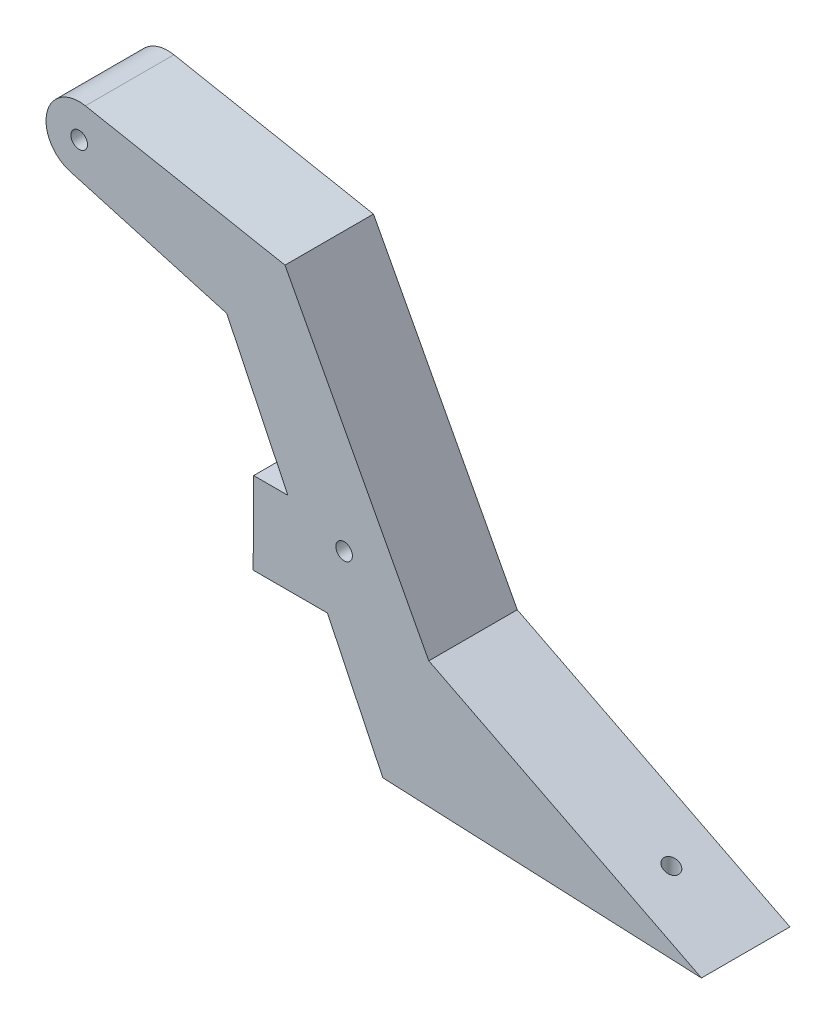
ISO-10303-21;
HEADER;
FILE_DESCRIPTION(('STEP AP214'),'2;1');
FILE_NAME('part.step','',(''),(''),'','','');
FILE_SCHEMA(('AUTOMOTIVE_DESIGN { 1 0 10303 214 1 1 1 1 }'));
ENDSEC;
DATA;
#1=APPLICATION_CONTEXT('core data for automotive mechanical design processes');
#2=APPLICATION_PROTOCOL_DEFINITION('international standard','automotive_design',2000,#1);
#3=PRODUCT_CONTEXT('',#1,'mechanical');
#4=PRODUCT('Part','Part','',(#3));
#5=PRODUCT_RELATED_PRODUCT_CATEGORY('part','',(#4));
#6=PRODUCT_DEFINITION_FORMATION('','',#4);
#7=PRODUCT_DEFINITION_CONTEXT('part definition',#1,'design');
#8=PRODUCT_DEFINITION('design','',#6,#7);
#9=PRODUCT_DEFINITION_SHAPE('','',#8);
#10=(LENGTH_UNIT() NAMED_UNIT(*) SI_UNIT(.MILLI.,.METRE.));
#11=(NAMED_UNIT(*) PLANE_ANGLE_UNIT() SI_UNIT($,.RADIAN.));
#12=(NAMED_UNIT(*) SI_UNIT($,.STERADIAN.) SOLID_ANGLE_UNIT());
#13=UNCERTAINTY_MEASURE_WITH_UNIT(LENGTH_MEASURE(1.E-05),#10,'distance_accuracy_value','');
#14=(GEOMETRIC_REPRESENTATION_CONTEXT(3) GLOBAL_UNCERTAINTY_ASSIGNED_CONTEXT((#13)) GLOBAL_UNIT_ASSIGNED_CONTEXT((#10,
#11,#12)) REPRESENTATION_CONTEXT('',''));
#15=CARTESIAN_POINT('',(0.,0.,0.));
#16=DIRECTION('',(0.,0.,1.));
#17=DIRECTION('',(1.,0.,0.));
#18=AXIS2_PLACEMENT_3D('',#15,#16,#17);
#19=CARTESIAN_POINT('',(26.6827335987823,-13.8357209188859,-17.));
#20=DIRECTION('',(0.900994795632333,0.433829895516032,0.));
#21=DIRECTION('',(-0.433829895516032,0.900994795632333,0.));
#22=AXIS2_PLACEMENT_3D('',#19,#20,#21);
#23=PLANE('',#22);
#24=DIRECTION('',(0.,0.,1.));
#25=VECTOR('',#24,1.);
#26=CARTESIAN_POINT('',(44.8954731018816,-51.6606464855785,0.));
#27=LINE('',#26,#25);
#28=CARTESIAN_POINT('',(44.8954731018816,-51.6606464855785,0.));
#29=VERTEX_POINT('',#28);
#30=CARTESIAN_POINT('',(44.8954731018816,-51.6606464855785,16.));
#31=VERTEX_POINT('',#30);
#32=EDGE_CURVE('E62',#29,#31,#27,.T.);
#33=ORIENTED_EDGE('',*,*,#32,.F.);
#34=DIRECTION('',(-0.433829895516032,0.900994795632333,0.));
#35=VECTOR('',#34,1.);
#36=CARTESIAN_POINT('',(16.2527340455594,7.82570770332413,0.));
#37=LINE('',#36,#35);
#38=CARTESIAN_POINT('',(54.9111175536976,-72.4615263218011,0.));
#39=VERTEX_POINT('',#38);
#40=EDGE_CURVE('E167',#39,#29,#37,.T.);
#41=ORIENTED_EDGE('',*,*,#40,.F.);
#42=DIRECTION('',(0.,0.,1.));
#43=VECTOR('',#42,1.);
#44=CARTESIAN_POINT('',(54.9111175536976,-72.4615263218011,-17.));
#45=LINE('',#44,#43);
#46=CARTESIAN_POINT('',(54.9111175536976,-72.4615263218011,16.));
#47=VERTEX_POINT('',#46);
#48=EDGE_CURVE('E165',#39,#47,#45,.T.);
#49=ORIENTED_EDGE('',*,*,#48,.T.);
#50=DIRECTION('',(-0.433829895516032,0.900994795632333,0.));
#51=VECTOR('',#50,1.);
#52=CARTESIAN_POINT('',(26.6827335987823,-13.8357209188859,16.));
#53=LINE('',#52,#51);
#54=EDGE_CURVE('E163',#47,#31,#53,.T.);
#55=ORIENTED_EDGE('',*,*,#54,.T.);
#56=EDGE_LOOP('',(#33,#41,#49,#55));
#57=FACE_BOUND('',#56,.T.);
#58=ADVANCED_FACE('F37',(#57),#23,.F.);
#59=CARTESIAN_POINT('',(0.,0.,16.));
#60=DIRECTION('',(0.,0.,1.));
#61=DIRECTION('',(1.,0.,0.));
#62=AXIS2_PLACEMENT_3D('',#59,#60,#61);
#63=PLANE('',#62);
#64=CARTESIAN_POINT('',(47.9111175536976,-40.4615263218011,16.));
#65=DIRECTION('',(0.,0.,1.));
#66=DIRECTION('',(1.,0.,0.));
#67=AXIS2_PLACEMENT_3D('',#64,#65,#66);
#68=CIRCLE('',#67,1.5);
#69=CARTESIAN_POINT('',(49.4111175536976,-40.4615263218011,16.));
#70=VERTEX_POINT('',#69);
#71=EDGE_CURVE('E152',#70,#70,#68,.T.);
#72=ORIENTED_EDGE('',*,*,#71,.F.);
#73=EDGE_LOOP('',(#72));
#74=FACE_BOUND('',#73,.T.);
#75=ORIENTED_EDGE('',*,*,#54,.F.);
#76=DIRECTION('',(0.999031203229182,-0.0440074422621161,0.));
#77=VECTOR('',#76,1.);
#78=CARTESIAN_POINT('',(112.538061605381,-75.,16.));
#79=LINE('',#78,#77);
#80=CARTESIAN_POINT('',(112.538061605381,-75.,16.));
#81=VERTEX_POINT('',#80);
#82=EDGE_CURVE('E192',#47,#81,#79,.T.);
#83=ORIENTED_EDGE('',*,*,#82,.T.);
#84=DIRECTION('',(-0.891770927429079,0.452487141245228,0.));
#85=VECTOR('',#84,1.);
#86=CARTESIAN_POINT('',(63.2279842048484,-49.979924472451,16.));
#87=LINE('',#86,#85);
#88=CARTESIAN_POINT('',(63.2279842048484,-49.979924472451,16.));
#89=VERTEX_POINT('',#88);
#90=EDGE_CURVE('E194',#81,#89,#87,.T.);
#91=ORIENTED_EDGE('',*,*,#90,.T.);
#92=DIRECTION('',(-0.469004414457743,0.883195821558928,0.));
#93=VECTOR('',#92,1.);
#94=CARTESIAN_POINT('',(37.2209746860255,-1.00537022475931,16.));
#95=LINE('',#94,#93);
#96=CARTESIAN_POINT('',(37.2209746860255,-1.00537022475931,16.));
#97=VERTEX_POINT('',#96);
#98=EDGE_CURVE('E197',#89,#97,#95,.T.);
#99=ORIENTED_EDGE('',*,*,#98,.T.);
#100=DIRECTION('',(-0.982220661889283,0.187730049160435,0.));
#101=VECTOR('',#100,1.);
#102=CARTESIAN_POINT('',(1.12638029496261,5.8933239713357,16.));
#103=LINE('',#102,#101);
#104=CARTESIAN_POINT('',(1.12638029496261,5.8933239713357,16.));
#105=VERTEX_POINT('',#104);
#106=EDGE_CURVE('E199',#97,#105,#103,.T.);
#107=ORIENTED_EDGE('',*,*,#106,.T.);
#108=CARTESIAN_POINT('',(0.,0.,16.));
#109=DIRECTION('',(0.,0.,1.));
#110=DIRECTION('',(1.,0.,0.));
#111=AXIS2_PLACEMENT_3D('',#108,#109,#110);
#112=CIRCLE('',#111,6.);
#113=CARTESIAN_POINT('',(-1.6430506475302,-5.77064853977875,16.));
#114=VERTEX_POINT('',#113);
#115=EDGE_CURVE('E201',#105,#114,#112,.T.);
#116=ORIENTED_EDGE('',*,*,#115,.T.);
#117=DIRECTION('',(0.961774756629791,-0.273841774588366,0.));
#118=VECTOR('',#117,1.);
#119=CARTESIAN_POINT('',(26.6827335987823,-13.8357209188859,16.));
#120=LINE('',#119,#118);
#121=CARTESIAN_POINT('',(26.6827335987823,-13.8357209188859,16.));
#122=VERTEX_POINT('',#121);
#123=EDGE_CURVE('E203',#114,#122,#120,.T.);
#124=ORIENTED_EDGE('',*,*,#123,.T.);
#125=CARTESIAN_POINT('',(37.7390571492395,-36.7979235719324,16.));
#126=VERTEX_POINT('',#125);
#127=EDGE_CURVE('E160',#126,#122,#53,.T.);
#128=ORIENTED_EDGE('',*,*,#127,.F.);
#129=DIRECTION('',(-1.,0.,0.));
#130=VECTOR('',#129,1.);
#131=CARTESIAN_POINT('',(0.,-36.7979235719324,16.));
#132=LINE('',#131,#130);
#133=CARTESIAN_POINT('',(31.5529393659352,-36.7979235719324,16.));
#134=VERTEX_POINT('',#133);
#135=EDGE_CURVE('E156',#126,#134,#132,.T.);
#136=ORIENTED_EDGE('',*,*,#135,.T.);
#137=DIRECTION('',(-0.00618972670800356,-0.999980843458154,0.));
#138=VECTOR('',#137,1.);
#139=CARTESIAN_POINT('',(31.7794952141717,-0.196710158580415,16.));
#140=LINE('',#139,#138);
#141=CARTESIAN_POINT('',(31.4609414106003,-51.6606464855785,16.));
#142=VERTEX_POINT('',#141);
#143=EDGE_CURVE('E128',#134,#142,#140,.T.);
#144=ORIENTED_EDGE('',*,*,#143,.T.);
#145=DIRECTION('',(-1.,0.,0.));
#146=VECTOR('',#145,1.);
#147=CARTESIAN_POINT('',(0.,-51.6606464855785,16.));
#148=LINE('',#147,#146);
#149=EDGE_CURVE('E147',#31,#142,#148,.T.);
#150=ORIENTED_EDGE('',*,*,#149,.F.);
#151=EDGE_LOOP('',(#75,#83,#91,#99,#107,#116,#124,#128,#136,#144,#150));
#152=FACE_BOUND('',#151,.T.);
#153=CARTESIAN_POINT('',(0.,0.,16.));
#154=DIRECTION('',(0.,0.,1.));
#155=DIRECTION('',(1.,0.,0.));
#156=AXIS2_PLACEMENT_3D('',#153,#154,#155);
#157=CIRCLE('',#156,1.5);
#158=CARTESIAN_POINT('',(1.5,0.,16.));
#159=VERTEX_POINT('',#158);
#160=EDGE_CURVE('E186',#159,#159,#157,.T.);
#161=ORIENTED_EDGE('',*,*,#160,.F.);
#162=EDGE_LOOP('',(#161));
#163=FACE_BOUND('',#162,.T.);
#164=ADVANCED_FACE('F254',(#74,#152,#163),#63,.T.);
#165=CARTESIAN_POINT('',(0.,0.,0.));
#166=DIRECTION('',(0.,0.,1.));
#167=DIRECTION('',(1.,0.,0.));
#168=AXIS2_PLACEMENT_3D('',#165,#166,#167);
#169=PLANE('',#168);
#170=CARTESIAN_POINT('',(47.9111175536976,-40.4615263218011,0.));
#171=DIRECTION('',(0.,0.,1.));
#172=DIRECTION('',(1.,0.,0.));
#173=AXIS2_PLACEMENT_3D('',#170,#171,#172);
#174=CIRCLE('',#173,1.5);
#175=CARTESIAN_POINT('',(49.4111175536976,-40.4615263218011,0.));
#176=VERTEX_POINT('',#175);
#177=EDGE_CURVE('E41',#176,#176,#174,.T.);
#178=ORIENTED_EDGE('',*,*,#177,.T.);
#179=EDGE_LOOP('',(#178));
#180=FACE_BOUND('',#179,.T.);
#181=DIRECTION('',(0.999031203229182,-0.0440074422621161,0.));
#182=VECTOR('',#181,1.);
#183=CARTESIAN_POINT('',(112.538061605381,-75.,0.));
#184=LINE('',#183,#182);
#185=CARTESIAN_POINT('',(112.538061605381,-75.,0.));
#186=VERTEX_POINT('',#185);
#187=EDGE_CURVE('E189',#39,#186,#184,.T.);
#188=ORIENTED_EDGE('',*,*,#187,.F.);
#189=ORIENTED_EDGE('',*,*,#40,.T.);
#190=DIRECTION('',(-1.,0.,0.));
#191=VECTOR('',#190,1.);
#192=CARTESIAN_POINT('',(0.,-51.6606464855785,0.));
#193=LINE('',#192,#191);
#194=CARTESIAN_POINT('',(31.4609414106003,-51.6606464855785,0.));
#195=VERTEX_POINT('',#194);
#196=EDGE_CURVE('E134',#29,#195,#193,.T.);
#197=ORIENTED_EDGE('',*,*,#196,.T.);
#198=DIRECTION('',(-0.00618972670800356,-0.999980843458154,0.));
#199=VECTOR('',#198,1.);
#200=CARTESIAN_POINT('',(31.7794952141717,-0.196710158580415,0.));
#201=LINE('',#200,#199);
#202=CARTESIAN_POINT('',(31.5529393659352,-36.7979235719324,0.));
#203=VERTEX_POINT('',#202);
#204=EDGE_CURVE('E126',#203,#195,#201,.T.);
#205=ORIENTED_EDGE('',*,*,#204,.F.);
#206=DIRECTION('',(-1.,0.,0.));
#207=VECTOR('',#206,1.);
#208=CARTESIAN_POINT('',(0.,-36.7979235719324,0.));
#209=LINE('',#208,#207);
#210=CARTESIAN_POINT('',(37.7390571492395,-36.7979235719324,0.));
#211=VERTEX_POINT('',#210);
#212=EDGE_CURVE('E141',#211,#203,#209,.T.);
#213=ORIENTED_EDGE('',*,*,#212,.F.);
#214=CARTESIAN_POINT('',(26.6827335987823,-13.8357209188859,0.));
#215=VERTEX_POINT('',#214);
#216=EDGE_CURVE('E54',#211,#215,#37,.T.);
#217=ORIENTED_EDGE('',*,*,#216,.T.);
#218=DIRECTION('',(0.961774756629791,-0.273841774588366,0.));
#219=VECTOR('',#218,1.);
#220=CARTESIAN_POINT('',(26.6827335987823,-13.8357209188859,0.));
#221=LINE('',#220,#219);
#222=CARTESIAN_POINT('',(-1.6430506475302,-5.77064853977875,0.));
#223=VERTEX_POINT('',#222);
#224=EDGE_CURVE('E195',#223,#215,#221,.T.);
#225=ORIENTED_EDGE('',*,*,#224,.F.);
#226=CARTESIAN_POINT('',(0.,0.,0.));
#227=DIRECTION('',(0.,0.,1.));
#228=DIRECTION('',(1.,0.,0.));
#229=AXIS2_PLACEMENT_3D('',#226,#227,#228);
#230=CIRCLE('',#229,6.);
#231=CARTESIAN_POINT('',(1.12638029496261,5.8933239713357,0.));
#232=VERTEX_POINT('',#231);
#233=EDGE_CURVE('E214',#232,#223,#230,.T.);
#234=ORIENTED_EDGE('',*,*,#233,.F.);
#235=DIRECTION('',(-0.982220661889283,0.187730049160435,0.));
#236=VECTOR('',#235,1.);
#237=CARTESIAN_POINT('',(1.12638029496261,5.8933239713357,0.));
#238=LINE('',#237,#236);
#239=CARTESIAN_POINT('',(37.2209746860255,-1.00537022475931,0.));
#240=VERTEX_POINT('',#239);
#241=EDGE_CURVE('E212',#240,#232,#238,.T.);
#242=ORIENTED_EDGE('',*,*,#241,.F.);
#243=DIRECTION('',(-0.469004414457743,0.883195821558928,0.));
#244=VECTOR('',#243,1.);
#245=CARTESIAN_POINT('',(37.2209746860255,-1.00537022475931,0.));
#246=LINE('',#245,#244);
#247=CARTESIAN_POINT('',(63.2279842048484,-49.979924472451,0.));
#248=VERTEX_POINT('',#247);
#249=EDGE_CURVE('E210',#248,#240,#246,.T.);
#250=ORIENTED_EDGE('',*,*,#249,.F.);
#251=DIRECTION('',(-0.891770927429079,0.452487141245228,0.));
#252=VECTOR('',#251,1.);
#253=CARTESIAN_POINT('',(63.2279842048484,-49.979924472451,0.));
#254=LINE('',#253,#252);
#255=EDGE_CURVE('E208',#186,#248,#254,.T.);
#256=ORIENTED_EDGE('',*,*,#255,.F.);
#257=EDGE_LOOP('',(#188,#189,#197,#205,#213,#217,#225,#234,#242,#250,#256));
#258=FACE_BOUND('',#257,.T.);
#259=CARTESIAN_POINT('',(0.,0.,0.));
#260=DIRECTION('',(0.,0.,1.));
#261=DIRECTION('',(1.,0.,0.));
#262=AXIS2_PLACEMENT_3D('',#259,#260,#261);
#263=CIRCLE('',#262,1.5);
#264=CARTESIAN_POINT('',(1.5,0.,0.));
#265=VERTEX_POINT('',#264);
#266=EDGE_CURVE('E182',#265,#265,#263,.T.);
#267=ORIENTED_EDGE('',*,*,#266,.T.);
#268=EDGE_LOOP('',(#267));
#269=FACE_BOUND('',#268,.T.);
#270=ADVANCED_FACE('F139',(#180,#258,#269),#169,.F.);
#271=CARTESIAN_POINT('',(112.538061605381,-75.,16.));
#272=DIRECTION('',(0.0440074422621161,0.999031203229182,0.));
#273=DIRECTION('',(-0.999031203229182,0.0440074422621161,0.));
#274=AXIS2_PLACEMENT_3D('',#271,#272,#273);
#275=PLANE('',#274);
#276=CARTESIAN_POINT('',(98.8217695266379,-74.3957957171363,8.));
#277=DIRECTION('',(-0.0440074422621161,-0.999031203229182,0.));
#278=DIRECTION('',(0.999031203229182,-0.0440074422621161,0.));
#279=AXIS2_PLACEMENT_3D('',#276,#277,#278);
#280=CIRCLE('',#279,1.35000000000001);
#281=CARTESIAN_POINT('',(100.170461650997,-74.4552057641901,8.));
#282=VERTEX_POINT('',#281);
#283=EDGE_CURVE('E170',#282,#282,#280,.T.);
#284=ORIENTED_EDGE('',*,*,#283,.F.);
#285=EDGE_LOOP('',(#284));
#286=FACE_BOUND('',#285,.T.);
#287=CARTESIAN_POINT('',(80.8392078685126,-73.6036617564182,8.));
#288=DIRECTION('',(-0.0440074422621161,-0.999031203229182,0.));
#289=DIRECTION('',(0.999031203229182,-0.0440074422621161,0.));
#290=AXIS2_PLACEMENT_3D('',#287,#288,#289);
#291=CIRCLE('',#290,1.35000000000001);
#292=CARTESIAN_POINT('',(82.1878999928721,-73.6630718034721,8.));
#293=VERTEX_POINT('',#292);
#294=EDGE_CURVE('E169',#293,#293,#291,.T.);
#295=ORIENTED_EDGE('',*,*,#294,.F.);
#296=EDGE_LOOP('',(#295));
#297=FACE_BOUND('',#296,.T.);
#298=CARTESIAN_POINT('',(62.8566462103874,-72.8115277957001,8.));
#299=DIRECTION('',(-0.0440074422621161,-0.999031203229182,0.));
#300=DIRECTION('',(0.999031203229182,-0.0440074422621161,0.));
#301=AXIS2_PLACEMENT_3D('',#298,#299,#300);
#302=CIRCLE('',#301,1.35000000000001);
#303=CARTESIAN_POINT('',(64.2053383347468,-72.870937842754,8.));
#304=VERTEX_POINT('',#303);
#305=EDGE_CURVE('E183',#304,#304,#302,.T.);
#306=ORIENTED_EDGE('',*,*,#305,.F.);
#307=EDGE_LOOP('',(#306));
#308=FACE_BOUND('',#307,.T.);
#309=ORIENTED_EDGE('',*,*,#82,.F.);
#310=ORIENTED_EDGE('',*,*,#48,.F.);
#311=ORIENTED_EDGE('',*,*,#187,.T.);
#312=DIRECTION('',(0.,0.,-1.));
#313=VECTOR('',#312,1.);
#314=CARTESIAN_POINT('',(112.538061605381,-75.,16.));
#315=LINE('',#314,#313);
#316=EDGE_CURVE('E11',#81,#186,#315,.T.);
#317=ORIENTED_EDGE('',*,*,#316,.F.);
#318=EDGE_LOOP('',(#309,#310,#311,#317));
#319=FACE_BOUND('',#318,.T.);
#320=ADVANCED_FACE('F39',(#286,#297,#308,#319),#275,.F.);
#321=CARTESIAN_POINT('',(63.2279842048484,-49.979924472451,16.));
#322=DIRECTION('',(-0.452487141245229,-0.89177092742908,0.));
#323=DIRECTION('',(0.891770927429079,-0.452487141245228,0.));
#324=AXIS2_PLACEMENT_3D('',#321,#322,#323);
#325=PLANE('',#324);
#326=CARTESIAN_POINT('',(99.0956086321407,-68.1792605812789,8.));
#327=DIRECTION('',(-0.452487141245229,-0.89177092742908,0.));
#328=DIRECTION('',(0.891770927429079,-0.452487141245228,0.));
#329=AXIS2_PLACEMENT_3D('',#326,#327,#328);
#330=ELLIPSE('',#329,1.48218124282779,1.35000000000001);
#331=CARTESIAN_POINT('',(100.417374773675,-68.8499285346534,8.));
#332=VERTEX_POINT('',#331);
#333=EDGE_CURVE('E173',#332,#332,#330,.T.);
#334=ORIENTED_EDGE('',*,*,#333,.T.);
#335=EDGE_LOOP('',(#334));
#336=FACE_BOUND('',#335,.T.);
#337=ORIENTED_EDGE('',*,*,#255,.T.);
#338=DIRECTION('',(0.,0.,-1.));
#339=VECTOR('',#338,1.);
#340=CARTESIAN_POINT('',(63.2279842048484,-49.979924472451,16.));
#341=LINE('',#340,#339);
#342=EDGE_CURVE('E46',#89,#248,#341,.T.);
#343=ORIENTED_EDGE('',*,*,#342,.F.);
#344=ORIENTED_EDGE('',*,*,#90,.F.);
#345=ORIENTED_EDGE('',*,*,#316,.T.);
#346=EDGE_LOOP('',(#337,#343,#344,#345));
#347=FACE_BOUND('',#346,.T.);
#348=ADVANCED_FACE('F232',(#336,#347),#325,.F.);
#349=CARTESIAN_POINT('',(37.2209746860255,-1.00537022475931,16.));
#350=DIRECTION('',(-0.883195821558928,-0.469004414457743,0.));
#351=DIRECTION('',(0.469004414457743,-0.883195821558928,0.));
#352=AXIS2_PLACEMENT_3D('',#349,#350,#351);
#353=PLANE('',#352);
#354=ORIENTED_EDGE('',*,*,#249,.T.);
#355=DIRECTION('',(0.,0.,-1.));
#356=VECTOR('',#355,1.);
#357=CARTESIAN_POINT('',(37.2209746860255,-1.00537022475931,16.));
#358=LINE('',#357,#356);
#359=EDGE_CURVE('E225',#97,#240,#358,.T.);
#360=ORIENTED_EDGE('',*,*,#359,.F.);
#361=ORIENTED_EDGE('',*,*,#98,.F.);
#362=ORIENTED_EDGE('',*,*,#342,.T.);
#363=EDGE_LOOP('',(#354,#360,#361,#362));
#364=FACE_BOUND('',#363,.T.);
#365=ADVANCED_FACE('F294',(#364),#353,.F.);
#366=CARTESIAN_POINT('',(1.12638029496261,5.8933239713357,16.));
#367=DIRECTION('',(-0.187730049160435,-0.982220661889283,0.));
#368=DIRECTION('',(0.982220661889283,-0.187730049160435,0.));
#369=AXIS2_PLACEMENT_3D('',#366,#367,#368);
#370=PLANE('',#369);
#371=ORIENTED_EDGE('',*,*,#241,.T.);
#372=DIRECTION('',(0.,0.,-1.));
#373=VECTOR('',#372,1.);
#374=CARTESIAN_POINT('',(1.12638029496261,5.8933239713357,16.));
#375=LINE('',#374,#373);
#376=EDGE_CURVE('E222',#105,#232,#375,.T.);
#377=ORIENTED_EDGE('',*,*,#376,.F.);
#378=ORIENTED_EDGE('',*,*,#106,.F.);
#379=ORIENTED_EDGE('',*,*,#359,.T.);
#380=EDGE_LOOP('',(#371,#377,#378,#379));
#381=FACE_BOUND('',#380,.T.);
#382=ADVANCED_FACE('F290',(#381),#370,.F.);
#383=CARTESIAN_POINT('',(0.,0.,16.));
#384=DIRECTION('',(0.,0.,-1.));
#385=DIRECTION('',(-1.,0.,0.));
#386=AXIS2_PLACEMENT_3D('',#383,#384,#385);
#387=CYLINDRICAL_SURFACE('',#386,6.);
#388=ORIENTED_EDGE('',*,*,#233,.T.);
#389=DIRECTION('',(0.,0.,-1.));
#390=VECTOR('',#389,1.);
#391=CARTESIAN_POINT('',(-1.6430506475302,-5.77064853977875,16.));
#392=LINE('',#391,#390);
#393=EDGE_CURVE('E219',#114,#223,#392,.T.);
#394=ORIENTED_EDGE('',*,*,#393,.F.);
#395=ORIENTED_EDGE('',*,*,#115,.F.);
#396=ORIENTED_EDGE('',*,*,#376,.T.);
#397=EDGE_LOOP('',(#388,#394,#395,#396));
#398=FACE_BOUND('',#397,.T.);
#399=ADVANCED_FACE('F286',(#398),#387,.T.);
#400=CARTESIAN_POINT('',(26.6827335987823,-13.8357209188859,16.));
#401=DIRECTION('',(0.273841774588366,0.961774756629791,0.));
#402=DIRECTION('',(-0.961774756629791,0.273841774588366,0.));
#403=AXIS2_PLACEMENT_3D('',#400,#401,#402);
#404=PLANE('',#403);
#405=ORIENTED_EDGE('',*,*,#224,.T.);
#406=DIRECTION('',(0.,0.,-1.));
#407=VECTOR('',#406,1.);
#408=CARTESIAN_POINT('',(26.6827335987823,-13.8357209188859,16.));
#409=LINE('',#408,#407);
#410=EDGE_CURVE('E206',#122,#215,#409,.T.);
#411=ORIENTED_EDGE('',*,*,#410,.F.);
#412=ORIENTED_EDGE('',*,*,#123,.F.);
#413=ORIENTED_EDGE('',*,*,#393,.T.);
#414=EDGE_LOOP('',(#405,#411,#412,#413));
#415=FACE_BOUND('',#414,.T.);
#416=ADVANCED_FACE('F279',(#415),#404,.F.);
#417=CARTESIAN_POINT('',(0.,0.,16.));
#418=DIRECTION('',(0.,0.,-1.));
#419=DIRECTION('',(-1.,0.,0.));
#420=AXIS2_PLACEMENT_3D('',#417,#418,#419);
#421=CYLINDRICAL_SURFACE('',#420,1.5);
#422=ORIENTED_EDGE('',*,*,#160,.T.);
#423=EDGE_LOOP('',(#422));
#424=FACE_BOUND('',#423,.T.);
#425=ORIENTED_EDGE('',*,*,#266,.F.);
#426=EDGE_LOOP('',(#425));
#427=FACE_BOUND('',#426,.T.);
#428=ADVANCED_FACE('F276',(#424,#427),#421,.F.);
#429=CARTESIAN_POINT('',(63.2967206330085,-62.8212157634083,8.));
#430=DIRECTION('',(-0.0440074422621161,-0.999031203229182,0.));
#431=DIRECTION('',(0.999031203229182,-0.0440074422621161,0.));
#432=AXIS2_PLACEMENT_3D('',#429,#430,#431);
#433=CYLINDRICAL_SURFACE('',#432,1.35000000000001);
#434=CARTESIAN_POINT('',(63.2967206330085,-62.8212157634083,8.));
#435=DIRECTION('',(-0.0440074422621161,-0.999031203229182,0.));
#436=DIRECTION('',(0.999031203229182,-0.0440074422621161,0.));
#437=AXIS2_PLACEMENT_3D('',#434,#435,#436);
#438=CIRCLE('',#437,1.35000000000001);
#439=CARTESIAN_POINT('',(64.6454127573679,-62.8806258104621,8.));
#440=VERTEX_POINT('',#439);
#441=EDGE_CURVE('E179',#440,#440,#438,.T.);
#442=ORIENTED_EDGE('',*,*,#441,.F.);
#443=EDGE_LOOP('',(#442));
#444=FACE_BOUND('',#443,.T.);
#445=ORIENTED_EDGE('',*,*,#305,.T.);
#446=EDGE_LOOP('',(#445));
#447=FACE_BOUND('',#446,.T.);
#448=ADVANCED_FACE('F248',(#444,#447),#433,.F.);
#449=CARTESIAN_POINT('',(63.2967206330085,-62.8212157634083,8.));
#450=DIRECTION('',(-0.0440074422621161,-0.999031203229182,0.));
#451=DIRECTION('',(0.999031203229182,-0.0440074422621161,0.));
#452=AXIS2_PLACEMENT_3D('',#449,#450,#451);
#453=PLANE('',#452);
#454=ORIENTED_EDGE('',*,*,#441,.T.);
#455=EDGE_LOOP('',(#454));
#456=FACE_BOUND('',#455,.T.);
#457=ADVANCED_FACE('F238',(#456),#453,.T.);
#458=CARTESIAN_POINT('',(99.2618439492591,-64.4054836848445,8.));
#459=DIRECTION('',(-0.0440074422621161,-0.999031203229182,0.));
#460=DIRECTION('',(0.999031203229182,-0.0440074422621161,0.));
#461=AXIS2_PLACEMENT_3D('',#458,#459,#460);
#462=CYLINDRICAL_SURFACE('',#461,1.35000000000001);
#463=ORIENTED_EDGE('',*,*,#283,.T.);
#464=EDGE_LOOP('',(#463));
#465=FACE_BOUND('',#464,.T.);
#466=ORIENTED_EDGE('',*,*,#333,.F.);
#467=EDGE_LOOP('',(#466));
#468=FACE_BOUND('',#467,.T.);
#469=ADVANCED_FACE('F235',(#465,#468),#462,.F.);
#470=CARTESIAN_POINT('',(81.2792822911338,-63.6133497241264,8.));
#471=DIRECTION('',(-0.0440074422621161,-0.999031203229182,0.));
#472=DIRECTION('',(0.999031203229182,-0.0440074422621161,0.));
#473=AXIS2_PLACEMENT_3D('',#470,#471,#472);
#474=CYLINDRICAL_SURFACE('',#473,1.35000000000001);
#475=CARTESIAN_POINT('',(81.2792822911338,-63.6133497241264,8.));
#476=DIRECTION('',(-0.0440074422621161,-0.999031203229182,0.));
#477=DIRECTION('',(0.999031203229182,-0.0440074422621161,0.));
#478=AXIS2_PLACEMENT_3D('',#475,#476,#477);
#479=CIRCLE('',#478,1.35000000000001);
#480=CARTESIAN_POINT('',(82.6279744154932,-63.6727597711802,8.));
#481=VERTEX_POINT('',#480);
#482=EDGE_CURVE('E174',#481,#481,#479,.T.);
#483=ORIENTED_EDGE('',*,*,#482,.F.);
#484=EDGE_LOOP('',(#483));
#485=FACE_BOUND('',#484,.T.);
#486=ORIENTED_EDGE('',*,*,#294,.T.);
#487=EDGE_LOOP('',(#486));
#488=FACE_BOUND('',#487,.T.);
#489=ADVANCED_FACE('F237',(#485,#488),#474,.F.);
#490=CARTESIAN_POINT('',(81.2792822911338,-63.6133497241264,8.));
#491=DIRECTION('',(-0.0440074422621161,-0.999031203229182,0.));
#492=DIRECTION('',(0.999031203229182,-0.0440074422621161,0.));
#493=AXIS2_PLACEMENT_3D('',#490,#491,#492);
#494=PLANE('',#493);
#495=ORIENTED_EDGE('',*,*,#482,.T.);
#496=EDGE_LOOP('',(#495));
#497=FACE_BOUND('',#496,.T.);
#498=ADVANCED_FACE('F245',(#497),#494,.T.);
#499=ORIENTED_EDGE('',*,*,#216,.F.);
#500=DIRECTION('',(0.,0.,1.));
#501=VECTOR('',#500,1.);
#502=CARTESIAN_POINT('',(37.7390571492395,-36.7979235719324,0.));
#503=LINE('',#502,#501);
#504=EDGE_CURVE('E146',#211,#126,#503,.T.);
#505=ORIENTED_EDGE('',*,*,#504,.T.);
#506=ORIENTED_EDGE('',*,*,#127,.T.);
#507=ORIENTED_EDGE('',*,*,#410,.T.);
#508=EDGE_LOOP('',(#499,#505,#506,#507));
#509=FACE_BOUND('',#508,.T.);
#510=ADVANCED_FACE('F255',(#509),#23,.F.);
#511=CARTESIAN_POINT('',(0.,-36.7979235719324,0.));
#512=DIRECTION('',(0.,1.,0.));
#513=DIRECTION('',(0.,0.,1.));
#514=AXIS2_PLACEMENT_3D('',#511,#512,#513);
#515=PLANE('',#514);
#516=ORIENTED_EDGE('',*,*,#135,.F.);
#517=ORIENTED_EDGE('',*,*,#504,.F.);
#518=ORIENTED_EDGE('',*,*,#212,.T.);
#519=DIRECTION('',(0.,0.,1.));
#520=VECTOR('',#519,1.);
#521=CARTESIAN_POINT('',(31.5529393659352,-36.7979235719324,0.));
#522=LINE('',#521,#520);
#523=EDGE_CURVE('E123',#203,#134,#522,.T.);
#524=ORIENTED_EDGE('',*,*,#523,.T.);
#525=EDGE_LOOP('',(#516,#517,#518,#524));
#526=FACE_BOUND('',#525,.T.);
#527=ADVANCED_FACE('F145',(#526),#515,.T.);
#528=CARTESIAN_POINT('',(0.,-51.6606464855785,0.));
#529=DIRECTION('',(0.,1.,0.));
#530=DIRECTION('',(0.,0.,1.));
#531=AXIS2_PLACEMENT_3D('',#528,#529,#530);
#532=PLANE('',#531);
#533=ORIENTED_EDGE('',*,*,#149,.T.);
#534=DIRECTION('',(0.,0.,1.));
#535=VECTOR('',#534,1.);
#536=CARTESIAN_POINT('',(31.4609414106003,-51.6606464855785,0.));
#537=LINE('',#536,#535);
#538=EDGE_CURVE('E133',#195,#142,#537,.T.);
#539=ORIENTED_EDGE('',*,*,#538,.F.);
#540=ORIENTED_EDGE('',*,*,#196,.F.);
#541=ORIENTED_EDGE('',*,*,#32,.T.);
#542=EDGE_LOOP('',(#533,#539,#540,#541));
#543=FACE_BOUND('',#542,.T.);
#544=ADVANCED_FACE('F268',(#543),#532,.F.);
#545=CARTESIAN_POINT('',(31.7794952141717,-0.196710158580415,0.));
#546=DIRECTION('',(-0.999980843458154,0.00618972670800356,0.));
#547=DIRECTION('',(-0.00618972670800356,-0.999980843458154,0.));
#548=AXIS2_PLACEMENT_3D('',#545,#546,#547);
#549=PLANE('',#548);
#550=CARTESIAN_POINT('',(31.5070484409923,-44.2118285787775,8.));
#551=DIRECTION('',(-0.999980843458154,0.00618972670800356,0.));
#552=DIRECTION('',(-0.00618972670800356,-0.999980843458154,0.));
#553=AXIS2_PLACEMENT_3D('',#550,#551,#552);
#554=CIRCLE('',#553,1.8);
#555=CARTESIAN_POINT('',(31.4959069329179,-46.0117940970022,8.));
#556=VERTEX_POINT('',#555);
#557=EDGE_CURVE('E358',#556,#556,#554,.T.);
#558=ORIENTED_EDGE('',*,*,#557,.F.);
#559=EDGE_LOOP('',(#558));
#560=FACE_BOUND('',#559,.T.);
#561=ORIENTED_EDGE('',*,*,#143,.F.);
#562=ORIENTED_EDGE('',*,*,#523,.F.);
#563=ORIENTED_EDGE('',*,*,#204,.T.);
#564=ORIENTED_EDGE('',*,*,#538,.T.);
#565=EDGE_LOOP('',(#561,#562,#563,#564));
#566=FACE_BOUND('',#565,.T.);
#567=ADVANCED_FACE('F125',(#560,#566),#549,.T.);
#568=CARTESIAN_POINT('',(47.9111175536976,-40.4615263218011,-8.));
#569=DIRECTION('',(0.,0.,1.));
#570=DIRECTION('',(1.,0.,0.));
#571=AXIS2_PLACEMENT_3D('',#568,#569,#570);
#572=CYLINDRICAL_SURFACE('',#571,1.5);
#573=CARTESIAN_POINT('',(49.4111175536976,-40.4615263218011,16.));
#574=CARTESIAN_POINT('',(49.4111175536976,-40.4615263218011,15.8333333333333));
#575=CARTESIAN_POINT('',(49.4111175536976,-40.4615263218011,15.6666666666667));
#576=CARTESIAN_POINT('',(49.4111175536976,-40.4615263218011,15.3333333333333));
#577=CARTESIAN_POINT('',(49.4111175536976,-40.4615263218011,15.1666666666667));
#578=CARTESIAN_POINT('',(49.4111175536976,-40.4615263218011,14.8333333333333));
#579=CARTESIAN_POINT('',(49.4111175536976,-40.4615263218011,14.6666666666667));
#580=CARTESIAN_POINT('',(49.4111175536976,-40.4615263218011,14.3333333333333));
#581=CARTESIAN_POINT('',(49.4111175536976,-40.4615263218011,14.1666666666667));
#582=CARTESIAN_POINT('',(49.4111175536976,-40.4615263218011,13.8333333333333));
#583=CARTESIAN_POINT('',(49.4111175536976,-40.4615263218011,13.6666666666667));
#584=CARTESIAN_POINT('',(49.4111175536976,-40.4615263218011,13.3333333333333));
#585=CARTESIAN_POINT('',(49.4111175536976,-40.4615263218011,13.1666666666667));
#586=CARTESIAN_POINT('',(49.4111175536976,-40.4615263218011,12.8333333333333));
#587=CARTESIAN_POINT('',(49.4111175536976,-40.4615263218011,12.6666666666667));
#588=CARTESIAN_POINT('',(49.4111175536976,-40.4615263218011,12.3333333333333));
#589=CARTESIAN_POINT('',(49.4111175536976,-40.4615263218011,12.1666666666667));
#590=CARTESIAN_POINT('',(49.4111175536976,-40.4615263218011,11.8333333333333));
#591=CARTESIAN_POINT('',(49.4111175536976,-40.4615263218011,11.6666666666667));
#592=CARTESIAN_POINT('',(49.4111175536976,-40.4615263218011,11.3333333333333));
#593=CARTESIAN_POINT('',(49.4111175536976,-40.4615263218011,11.1666666666667));
#594=CARTESIAN_POINT('',(49.4111175536976,-40.4615263218011,10.8333333333333));
#595=CARTESIAN_POINT('',(49.4111175536976,-40.4615263218011,10.6666666666667));
#596=CARTESIAN_POINT('',(49.4111175536976,-40.4615263218011,10.3333333333333));
#597=CARTESIAN_POINT('',(49.4111175536976,-40.4615263218011,10.1666666666667));
#598=CARTESIAN_POINT('',(49.4111175536976,-40.4615263218011,9.83333333333333));
#599=CARTESIAN_POINT('',(49.4111175536976,-40.4615263218011,9.66666666666667));
#600=CARTESIAN_POINT('',(49.4111175536976,-40.4615263218011,9.33333333333333));
#601=CARTESIAN_POINT('',(49.4111175536976,-40.4615263218011,9.16666666666666));
#602=CARTESIAN_POINT('',(49.4111175536976,-40.4615263218011,8.83333333333333));
#603=CARTESIAN_POINT('',(49.4111175536976,-40.4615263218011,8.66666666666667));
#604=CARTESIAN_POINT('',(49.4111175536976,-40.4615263218011,8.33333333333333));
#605=CARTESIAN_POINT('',(49.4111175536976,-40.4615263218011,8.16666666666667));
#606=CARTESIAN_POINT('',(49.4111175536976,-40.4615263218011,7.83333333333333));
#607=CARTESIAN_POINT('',(49.4111175536976,-40.4615263218011,7.66666666666667));
#608=CARTESIAN_POINT('',(49.4111175536976,-40.4615263218011,7.33333333333333));
#609=CARTESIAN_POINT('',(49.4111175536976,-40.4615263218011,7.16666666666667));
#610=CARTESIAN_POINT('',(49.4111175536976,-40.4615263218011,6.83333333333333));
#611=CARTESIAN_POINT('',(49.4111175536976,-40.4615263218011,6.66666666666667));
#612=CARTESIAN_POINT('',(49.4111175536976,-40.4615263218011,6.33333333333333));
#613=CARTESIAN_POINT('',(49.4111175536976,-40.4615263218011,6.16666666666667));
#614=CARTESIAN_POINT('',(49.4111175536976,-40.4615263218011,5.83333333333333));
#615=CARTESIAN_POINT('',(49.4111175536976,-40.4615263218011,5.66666666666667));
#616=CARTESIAN_POINT('',(49.4111175536976,-40.4615263218011,5.33333333333333));
#617=CARTESIAN_POINT('',(49.4111175536976,-40.4615263218011,5.16666666666667));
#618=CARTESIAN_POINT('',(49.4111175536976,-40.4615263218011,4.83333333333333));
#619=CARTESIAN_POINT('',(49.4111175536976,-40.4615263218011,4.66666666666667));
#620=CARTESIAN_POINT('',(49.4111175536976,-40.4615263218011,4.33333333333333));
#621=CARTESIAN_POINT('',(49.4111175536976,-40.4615263218011,4.16666666666667));
#622=CARTESIAN_POINT('',(49.4111175536976,-40.4615263218011,3.83333333333333));
#623=CARTESIAN_POINT('',(49.4111175536976,-40.4615263218011,3.66666666666667));
#624=CARTESIAN_POINT('',(49.4111175536976,-40.4615263218011,3.33333333333333));
#625=CARTESIAN_POINT('',(49.4111175536976,-40.4615263218011,3.16666666666667));
#626=CARTESIAN_POINT('',(49.4111175536976,-40.4615263218011,2.83333333333333));
#627=CARTESIAN_POINT('',(49.4111175536976,-40.4615263218011,2.66666666666667));
#628=CARTESIAN_POINT('',(49.4111175536976,-40.4615263218011,2.33333333333333));
#629=CARTESIAN_POINT('',(49.4111175536976,-40.4615263218011,2.16666666666667));
#630=CARTESIAN_POINT('',(49.4111175536976,-40.4615263218011,1.83333333333333));
#631=CARTESIAN_POINT('',(49.4111175536976,-40.4615263218011,1.66666666666666));
#632=CARTESIAN_POINT('',(49.4111175536976,-40.4615263218011,1.33333333333333));
#633=CARTESIAN_POINT('',(49.4111175536976,-40.4615263218011,1.16666666666667));
#634=CARTESIAN_POINT('',(49.4111175536976,-40.4615263218011,0.833333333333332));
#635=CARTESIAN_POINT('',(49.4111175536976,-40.4615263218011,0.666666666666666));
#636=CARTESIAN_POINT('',(49.4111175536976,-40.4615263218011,0.333333333333332));
#637=CARTESIAN_POINT('',(49.4111175536976,-40.4615263218011,0.166666666666665));
#638=CARTESIAN_POINT('',(49.4111175536976,-40.4615263218011,0.));
#639=B_SPLINE_CURVE_WITH_KNOTS('',3,(#573,#574,#575,#576,#577,#578,#579,#580,#581,#582,#583,
#584,#585,#586,#587,#588,#589,#590,#591,#592,#593,#594,#595,#596,#597,#598,#599,#600,#601,#602,
#603,#604,#605,#606,#607,#608,#609,#610,#611,#612,#613,#614,#615,#616,#617,#618,#619,#620,#621,
#622,#623,#624,#625,#626,#627,#628,#629,#630,#631,#632,#633,#634,#635,#636,#637,#638),
.UNSPECIFIED.,.F.,.F.,(4,2,2,2,2,2,2,2,2,2,2,2,2,2,2,2,2,2,2,2,2,2,2,2,2,2,2,2,2,2,2,2,4),(0.,
0.5,1.,1.5,2.,2.5,3.,3.5,4.,4.5,5.,5.5,6.,6.5,7.,7.5,8.,8.5,9.,9.5,10.,10.5,11.,11.5,12.,12.5,
13.,13.5,14.,14.5,15.,15.5,16.),.UNSPECIFIED.);
#640=EDGE_CURVE('BSEAM339',#70,#176,#639,.T.);
#641=ORIENTED_EDGE('',*,*,#71,.T.);
#642=ORIENTED_EDGE('',*,*,#177,.F.);
#643=ORIENTED_EDGE('',*,*,#640,.T.);
#644=ORIENTED_EDGE('',*,*,#640,.F.);
#645=EDGE_LOOP('',(#641,#643,#642,#644));
#646=FACE_BOUND('',#645,.T.);
#647=ADVANCED_FACE('F339',(#646),#572,.F.);
#648=CARTESIAN_POINT('',(41.5068568755739,-44.2737258458575,8.));
#649=DIRECTION('',(-0.999980843458154,0.00618972670800356,0.));
#650=DIRECTION('',(-0.00618972670800356,-0.999980843458154,0.));
#651=AXIS2_PLACEMENT_3D('',#648,#649,#650);
#652=CYLINDRICAL_SURFACE('',#651,1.8);
#653=CARTESIAN_POINT('',(41.5068568755739,-44.2737258458575,8.));
#654=DIRECTION('',(-0.999980843458154,0.00618972670800356,0.));
#655=DIRECTION('',(-0.00618972670800356,-0.999980843458154,0.));
#656=AXIS2_PLACEMENT_3D('',#653,#654,#655);
#657=CIRCLE('',#656,1.8);
#658=CARTESIAN_POINT('',(41.4957153674994,-46.0736913640822,8.));
#659=VERTEX_POINT('',#658);
#660=EDGE_CURVE('E357',#659,#659,#657,.T.);
#661=ORIENTED_EDGE('',*,*,#660,.F.);
#662=EDGE_LOOP('',(#661));
#663=FACE_BOUND('',#662,.T.);
#664=ORIENTED_EDGE('',*,*,#557,.T.);
#665=EDGE_LOOP('',(#664));
#666=FACE_BOUND('',#665,.T.);
#667=ADVANCED_FACE('F345',(#663,#666),#652,.F.);
#668=CARTESIAN_POINT('',(41.5068568755739,-44.2737258458575,8.));
#669=DIRECTION('',(-0.999980843458154,0.00618972670800356,0.));
#670=DIRECTION('',(-0.00618972670800356,-0.999980843458154,0.));
#671=AXIS2_PLACEMENT_3D('',#668,#669,#670);
#672=PLANE('',#671);
#673=ORIENTED_EDGE('',*,*,#660,.T.);
#674=EDGE_LOOP('',(#673));
#675=FACE_BOUND('',#674,.T.);
#676=ADVANCED_FACE('F349',(#675),#672,.T.);
#677=CLOSED_SHELL('',(#58,#164,#270,#320,#348,#365,#382,#399,#416,#428,#448,#457,#469,#489,#498,
#510,#527,#544,#567,#647,#667,#676));
#678=MANIFOLD_SOLID_BREP('B2',#677);
#679=ADVANCED_BREP_SHAPE_REPRESENTATION('',(#18,#678),#14);
#680=SHAPE_DEFINITION_REPRESENTATION(#9,#679);
ENDSEC;
END-ISO-10303-21;
